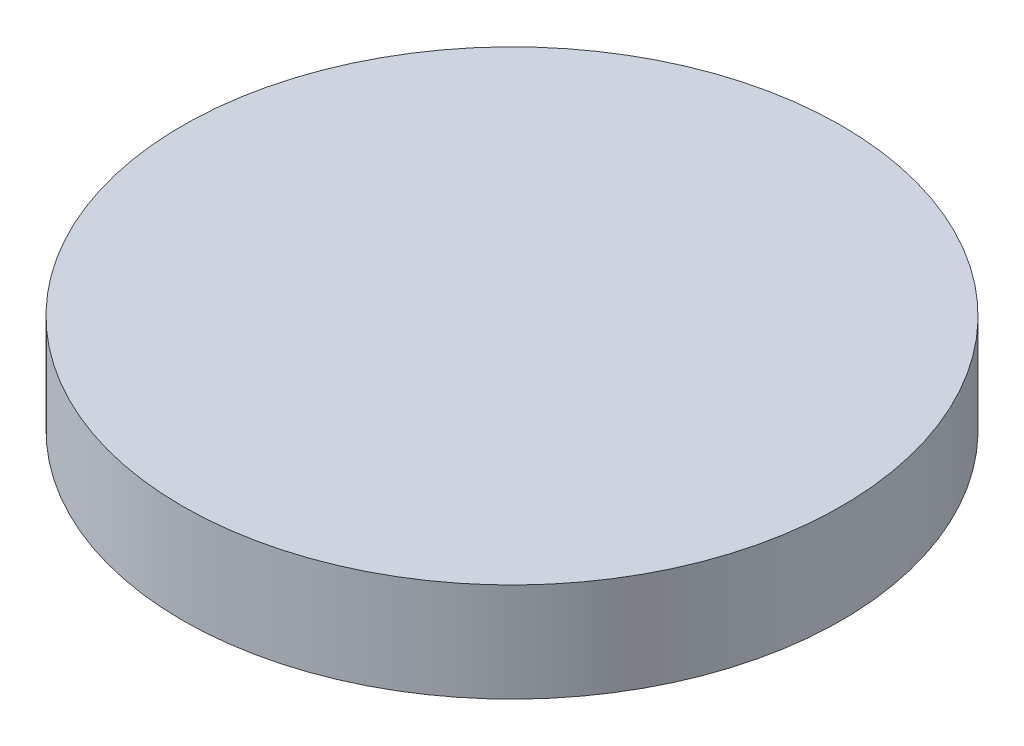
ISO-10303-21;
HEADER;
FILE_DESCRIPTION(('STEP AP214'),'2;1');
FILE_NAME('part.step','',(''),(''),'','','');
FILE_SCHEMA(('AUTOMOTIVE_DESIGN { 1 0 10303 214 1 1 1 1 }'));
ENDSEC;
DATA;
#1=APPLICATION_CONTEXT('core data for automotive mechanical design processes');
#2=APPLICATION_PROTOCOL_DEFINITION('international standard','automotive_design',2000,#1);
#3=PRODUCT_CONTEXT('',#1,'mechanical');
#4=PRODUCT('Part','Part','',(#3));
#5=PRODUCT_RELATED_PRODUCT_CATEGORY('part','',(#4));
#6=PRODUCT_DEFINITION_FORMATION('','',#4);
#7=PRODUCT_DEFINITION_CONTEXT('part definition',#1,'design');
#8=PRODUCT_DEFINITION('design','',#6,#7);
#9=PRODUCT_DEFINITION_SHAPE('','',#8);
#10=(LENGTH_UNIT() NAMED_UNIT(*) SI_UNIT(.MILLI.,.METRE.));
#11=(NAMED_UNIT(*) PLANE_ANGLE_UNIT() SI_UNIT($,.RADIAN.));
#12=(NAMED_UNIT(*) SI_UNIT($,.STERADIAN.) SOLID_ANGLE_UNIT());
#13=UNCERTAINTY_MEASURE_WITH_UNIT(LENGTH_MEASURE(1.E-05),#10,'distance_accuracy_value','');
#14=(GEOMETRIC_REPRESENTATION_CONTEXT(3) GLOBAL_UNCERTAINTY_ASSIGNED_CONTEXT((#13)) GLOBAL_UNIT_ASSIGNED_CONTEXT((#10,
#11,#12)) REPRESENTATION_CONTEXT('',''));
#15=CARTESIAN_POINT('',(0.,0.,0.));
#16=DIRECTION('',(0.,0.,1.));
#17=DIRECTION('',(1.,0.,0.));
#18=AXIS2_PLACEMENT_3D('',#15,#16,#17);
#19=CARTESIAN_POINT('',(0.,19.05,0.));
#20=DIRECTION('',(0.,-1.,0.));
#21=DIRECTION('',(0.,0.,-1.));
#22=AXIS2_PLACEMENT_3D('',#19,#20,#21);
#23=CYLINDRICAL_SURFACE('',#22,63.5);
#24=CARTESIAN_POINT('',(0.,19.05,0.));
#25=DIRECTION('',(0.,1.,0.));
#26=DIRECTION('',(0.,0.,1.));
#27=AXIS2_PLACEMENT_3D('',#24,#25,#26);
#28=CIRCLE('',#27,63.5);
#29=CARTESIAN_POINT('',(0.,19.05,-63.5));
#30=VERTEX_POINT('',#29);
#31=EDGE_CURVE('E10',#30,#30,#28,.T.);
#32=CARTESIAN_POINT('',(0.,0.,0.));
#33=DIRECTION('',(0.,1.,0.));
#34=DIRECTION('',(0.,0.,1.));
#35=AXIS2_PLACEMENT_3D('',#32,#33,#34);
#36=CIRCLE('',#35,63.5);
#37=CARTESIAN_POINT('',(0.,0.,-63.5));
#38=VERTEX_POINT('',#37);
#39=EDGE_CURVE('E33',#38,#38,#36,.T.);
#40=CARTESIAN_POINT('',(0.,19.05,-63.5));
#41=CARTESIAN_POINT('',(0.,18.8515625,-63.5));
#42=CARTESIAN_POINT('',(0.,18.653125,-63.5));
#43=CARTESIAN_POINT('',(0.,18.25625,-63.5));
#44=CARTESIAN_POINT('',(0.,18.0578125,-63.5));
#45=CARTESIAN_POINT('',(0.,17.6609375,-63.5));
#46=CARTESIAN_POINT('',(0.,17.4625,-63.5));
#47=CARTESIAN_POINT('',(0.,17.065625,-63.5));
#48=CARTESIAN_POINT('',(0.,16.8671875,-63.5));
#49=CARTESIAN_POINT('',(0.,16.4703125,-63.5));
#50=CARTESIAN_POINT('',(0.,16.271875,-63.5));
#51=CARTESIAN_POINT('',(0.,15.875,-63.5));
#52=CARTESIAN_POINT('',(0.,15.6765625,-63.5));
#53=CARTESIAN_POINT('',(0.,15.2796875,-63.5));
#54=CARTESIAN_POINT('',(0.,15.08125,-63.5));
#55=CARTESIAN_POINT('',(0.,14.684375,-63.5));
#56=CARTESIAN_POINT('',(0.,14.4859375,-63.5));
#57=CARTESIAN_POINT('',(0.,14.0890625,-63.5));
#58=CARTESIAN_POINT('',(0.,13.890625,-63.5));
#59=CARTESIAN_POINT('',(0.,13.49375,-63.5));
#60=CARTESIAN_POINT('',(0.,13.2953125,-63.5));
#61=CARTESIAN_POINT('',(0.,12.8984375,-63.5));
#62=CARTESIAN_POINT('',(0.,12.7,-63.5));
#63=CARTESIAN_POINT('',(0.,12.303125,-63.5));
#64=CARTESIAN_POINT('',(0.,12.1046875,-63.5));
#65=CARTESIAN_POINT('',(0.,11.7078125,-63.5));
#66=CARTESIAN_POINT('',(0.,11.509375,-63.5));
#67=CARTESIAN_POINT('',(0.,11.1125,-63.5));
#68=CARTESIAN_POINT('',(0.,10.9140625,-63.5));
#69=CARTESIAN_POINT('',(0.,10.5171875,-63.5));
#70=CARTESIAN_POINT('',(0.,10.31875,-63.5));
#71=CARTESIAN_POINT('',(0.,9.921875,-63.5));
#72=CARTESIAN_POINT('',(0.,9.7234375,-63.5));
#73=CARTESIAN_POINT('',(0.,9.3265625,-63.5));
#74=CARTESIAN_POINT('',(0.,9.128125,-63.5));
#75=CARTESIAN_POINT('',(0.,8.73125,-63.5));
#76=CARTESIAN_POINT('',(0.,8.5328125,-63.5));
#77=CARTESIAN_POINT('',(0.,8.1359375,-63.5));
#78=CARTESIAN_POINT('',(0.,7.9375,-63.5));
#79=CARTESIAN_POINT('',(0.,7.540625,-63.5));
#80=CARTESIAN_POINT('',(0.,7.3421875,-63.5));
#81=CARTESIAN_POINT('',(0.,6.9453125,-63.5));
#82=CARTESIAN_POINT('',(0.,6.746875,-63.5));
#83=CARTESIAN_POINT('',(0.,6.35,-63.5));
#84=CARTESIAN_POINT('',(0.,6.1515625,-63.5));
#85=CARTESIAN_POINT('',(0.,5.7546875,-63.5));
#86=CARTESIAN_POINT('',(0.,5.55625,-63.5));
#87=CARTESIAN_POINT('',(0.,5.159375,-63.5));
#88=CARTESIAN_POINT('',(0.,4.9609375,-63.5));
#89=CARTESIAN_POINT('',(0.,4.5640625,-63.5));
#90=CARTESIAN_POINT('',(0.,4.365625,-63.5));
#91=CARTESIAN_POINT('',(0.,3.96875,-63.5));
#92=CARTESIAN_POINT('',(0.,3.7703125,-63.5));
#93=CARTESIAN_POINT('',(0.,3.3734375,-63.5));
#94=CARTESIAN_POINT('',(0.,3.175,-63.5));
#95=CARTESIAN_POINT('',(0.,2.778125,-63.5));
#96=CARTESIAN_POINT('',(0.,2.5796875,-63.5));
#97=CARTESIAN_POINT('',(0.,2.1828125,-63.5));
#98=CARTESIAN_POINT('',(0.,1.984375,-63.5));
#99=CARTESIAN_POINT('',(0.,1.5875,-63.5));
#100=CARTESIAN_POINT('',(0.,1.3890625,-63.5));
#101=CARTESIAN_POINT('',(0.,0.992187500000001,-63.5));
#102=CARTESIAN_POINT('',(0.,0.793750000000001,-63.5));
#103=CARTESIAN_POINT('',(0.,0.396875,-63.5));
#104=CARTESIAN_POINT('',(0.,0.1984375,-63.5));
#105=CARTESIAN_POINT('',(0.,0.,-63.5));
#106=B_SPLINE_CURVE_WITH_KNOTS('',3,(#40,#41,#42,#43,#44,#45,#46,#47,#48,#49,#50,#51,#52,#53,
#54,#55,#56,#57,#58,#59,#60,#61,#62,#63,#64,#65,#66,#67,#68,#69,#70,#71,#72,#73,#74,#75,#76,#77,
#78,#79,#80,#81,#82,#83,#84,#85,#86,#87,#88,#89,#90,#91,#92,#93,#94,#95,#96,#97,#98,#99,#100,
#101,#102,#103,#104,#105),.UNSPECIFIED.,.F.,.F.,(4,2,2,2,2,2,2,2,2,2,2,2,2,2,2,2,2,2,2,2,2,2,2,
2,2,2,2,2,2,2,2,2,4),(0.,0.5953125,1.190625,1.7859375,2.38125,2.9765625,3.571875,4.1671875,
4.7625,5.3578125,5.953125,6.5484375,7.14375,7.7390625,8.334375,8.9296875,9.525,10.1203125,
10.715625,11.3109375,11.90625,12.5015625,13.096875,13.6921875,14.2875,14.8828125,15.478125,
16.0734375,16.66875,17.2640625,17.859375,18.4546875,19.05),.UNSPECIFIED.);
#107=EDGE_CURVE('BSEAM30',#30,#38,#106,.T.);
#108=ORIENTED_EDGE('',*,*,#31,.F.);
#109=ORIENTED_EDGE('',*,*,#39,.T.);
#110=ORIENTED_EDGE('',*,*,#107,.T.);
#111=ORIENTED_EDGE('',*,*,#107,.F.);
#112=EDGE_LOOP('',(#108,#110,#109,#111));
#113=FACE_BOUND('',#112,.T.);
#114=ADVANCED_FACE('F30',(#113),#23,.T.);
#115=CARTESIAN_POINT('',(0.,19.05,0.));
#116=DIRECTION('',(0.,1.,0.));
#117=DIRECTION('',(0.,0.,1.));
#118=AXIS2_PLACEMENT_3D('',#115,#116,#117);
#119=PLANE('',#118);
#120=ORIENTED_EDGE('',*,*,#31,.T.);
#121=EDGE_LOOP('',(#120));
#122=FACE_BOUND('',#121,.T.);
#123=ADVANCED_FACE('F52',(#122),#119,.T.);
#124=CARTESIAN_POINT('',(0.,0.,0.));
#125=DIRECTION('',(0.,1.,0.));
#126=DIRECTION('',(0.,0.,1.));
#127=AXIS2_PLACEMENT_3D('',#124,#125,#126);
#128=PLANE('',#127);
#129=ORIENTED_EDGE('',*,*,#39,.F.);
#130=EDGE_LOOP('',(#129));
#131=FACE_BOUND('',#130,.T.);
#132=ADVANCED_FACE('F50',(#131),#128,.F.);
#133=CLOSED_SHELL('',(#114,#123,#132));
#134=MANIFOLD_SOLID_BREP('B2',#133);
#135=ADVANCED_BREP_SHAPE_REPRESENTATION('',(#18,#134),#14);
#136=SHAPE_DEFINITION_REPRESENTATION(#9,#135);
ENDSEC;
END-ISO-10303-21;
